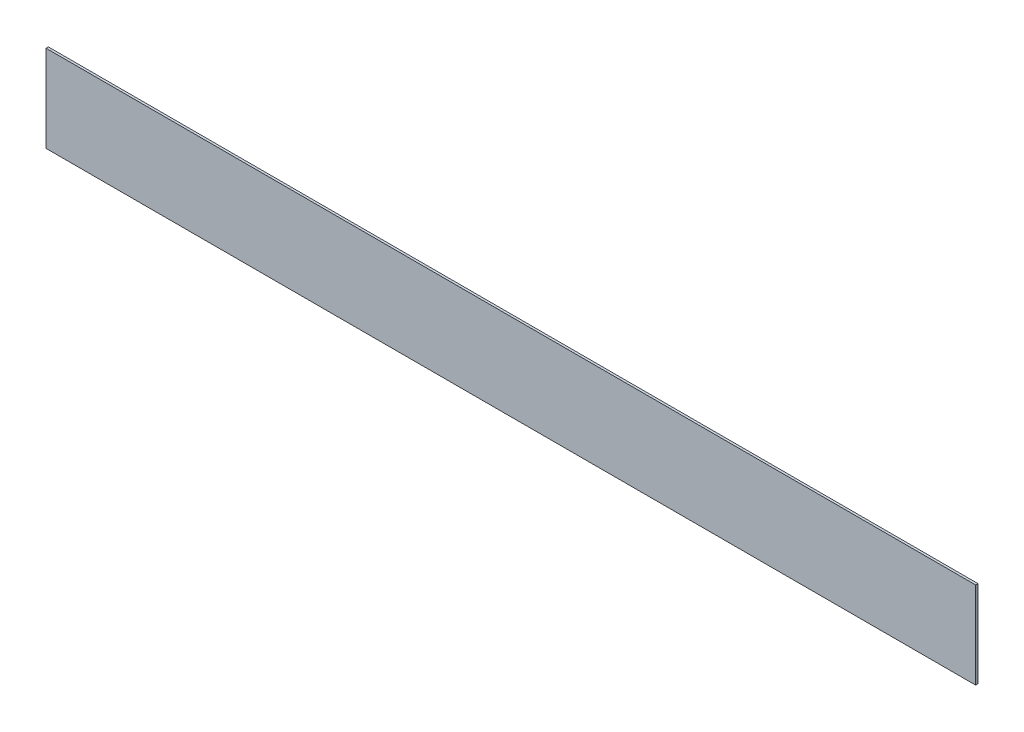
ISO-10303-21;
HEADER;
FILE_DESCRIPTION(('STEP AP214'),'2;1');
FILE_NAME('part.step','',(''),(''),'','','');
FILE_SCHEMA(('AUTOMOTIVE_DESIGN { 1 0 10303 214 1 1 1 1 }'));
ENDSEC;
DATA;
#1=APPLICATION_CONTEXT('core data for automotive mechanical design processes');
#2=APPLICATION_PROTOCOL_DEFINITION('international standard','automotive_design',2000,#1);
#3=PRODUCT_CONTEXT('',#1,'mechanical');
#4=PRODUCT('Part','Part','',(#3));
#5=PRODUCT_RELATED_PRODUCT_CATEGORY('part','',(#4));
#6=PRODUCT_DEFINITION_FORMATION('','',#4);
#7=PRODUCT_DEFINITION_CONTEXT('part definition',#1,'design');
#8=PRODUCT_DEFINITION('design','',#6,#7);
#9=PRODUCT_DEFINITION_SHAPE('','',#8);
#10=(LENGTH_UNIT() NAMED_UNIT(*) SI_UNIT(.MILLI.,.METRE.));
#11=(NAMED_UNIT(*) PLANE_ANGLE_UNIT() SI_UNIT($,.RADIAN.));
#12=(NAMED_UNIT(*) SI_UNIT($,.STERADIAN.) SOLID_ANGLE_UNIT());
#13=UNCERTAINTY_MEASURE_WITH_UNIT(LENGTH_MEASURE(1.E-05),#10,'distance_accuracy_value','');
#14=(GEOMETRIC_REPRESENTATION_CONTEXT(3) GLOBAL_UNCERTAINTY_ASSIGNED_CONTEXT((#13)) GLOBAL_UNIT_ASSIGNED_CONTEXT((#10,
#11,#12)) REPRESENTATION_CONTEXT('',''));
#15=CARTESIAN_POINT('',(0.,0.,0.));
#16=DIRECTION('',(0.,0.,1.));
#17=DIRECTION('',(1.,0.,0.));
#18=AXIS2_PLACEMENT_3D('',#15,#16,#17);
#19=CARTESIAN_POINT('',(457.2,42.672,1.143));
#20=DIRECTION('',(-1.,0.,0.));
#21=DIRECTION('',(0.,0.,1.));
#22=AXIS2_PLACEMENT_3D('',#19,#20,#21);
#23=PLANE('',#22);
#24=DIRECTION('',(0.,1.,0.));
#25=VECTOR('',#24,1.);
#26=CARTESIAN_POINT('',(457.2,42.672,-1.143));
#27=LINE('',#26,#25);
#28=CARTESIAN_POINT('',(457.2,-42.672,-1.143));
#29=VERTEX_POINT('',#28);
#30=CARTESIAN_POINT('',(457.2,42.672,-1.143));
#31=VERTEX_POINT('',#30);
#32=EDGE_CURVE('E96',#29,#31,#27,.T.);
#33=ORIENTED_EDGE('',*,*,#32,.T.);
#34=DIRECTION('',(0.,0.,-1.));
#35=VECTOR('',#34,1.);
#36=CARTESIAN_POINT('',(457.2,42.672,1.143));
#37=LINE('',#36,#35);
#38=CARTESIAN_POINT('',(457.2,42.672,1.143));
#39=VERTEX_POINT('',#38);
#40=EDGE_CURVE('E11',#39,#31,#37,.T.);
#41=ORIENTED_EDGE('',*,*,#40,.F.);
#42=DIRECTION('',(0.,1.,0.));
#43=VECTOR('',#42,1.);
#44=CARTESIAN_POINT('',(457.2,42.672,1.143));
#45=LINE('',#44,#43);
#46=CARTESIAN_POINT('',(457.2,-42.672,1.143));
#47=VERTEX_POINT('',#46);
#48=EDGE_CURVE('E84',#47,#39,#45,.T.);
#49=ORIENTED_EDGE('',*,*,#48,.F.);
#50=DIRECTION('',(0.,0.,-1.));
#51=VECTOR('',#50,1.);
#52=CARTESIAN_POINT('',(457.2,-42.672,1.143));
#53=LINE('',#52,#51);
#54=EDGE_CURVE('E92',#47,#29,#53,.T.);
#55=ORIENTED_EDGE('',*,*,#54,.T.);
#56=EDGE_LOOP('',(#33,#41,#49,#55));
#57=FACE_BOUND('',#56,.T.);
#58=ADVANCED_FACE('F33',(#57),#23,.F.);
#59=CARTESIAN_POINT('',(-457.2,42.672,1.143));
#60=DIRECTION('',(0.,-1.,0.));
#61=DIRECTION('',(0.,0.,-1.));
#62=AXIS2_PLACEMENT_3D('',#59,#60,#61);
#63=PLANE('',#62);
#64=DIRECTION('',(-1.,0.,0.));
#65=VECTOR('',#64,1.);
#66=CARTESIAN_POINT('',(-457.2,42.672,-1.143));
#67=LINE('',#66,#65);
#68=CARTESIAN_POINT('',(-457.2,42.672,-1.143));
#69=VERTEX_POINT('',#68);
#70=EDGE_CURVE('E88',#31,#69,#67,.T.);
#71=ORIENTED_EDGE('',*,*,#70,.T.);
#72=DIRECTION('',(0.,0.,-1.));
#73=VECTOR('',#72,1.);
#74=CARTESIAN_POINT('',(-457.2,42.672,1.143));
#75=LINE('',#74,#73);
#76=CARTESIAN_POINT('',(-457.2,42.672,1.143));
#77=VERTEX_POINT('',#76);
#78=EDGE_CURVE('E41',#77,#69,#75,.T.);
#79=ORIENTED_EDGE('',*,*,#78,.F.);
#80=DIRECTION('',(-1.,0.,0.));
#81=VECTOR('',#80,1.);
#82=CARTESIAN_POINT('',(-457.2,42.672,1.143));
#83=LINE('',#82,#81);
#84=EDGE_CURVE('E79',#39,#77,#83,.T.);
#85=ORIENTED_EDGE('',*,*,#84,.F.);
#86=ORIENTED_EDGE('',*,*,#40,.T.);
#87=EDGE_LOOP('',(#71,#79,#85,#86));
#88=FACE_BOUND('',#87,.T.);
#89=ADVANCED_FACE('F87',(#88),#63,.F.);
#90=CARTESIAN_POINT('',(-457.2,42.672,1.143));
#91=DIRECTION('',(1.,0.,0.));
#92=DIRECTION('',(0.,1.,0.));
#93=AXIS2_PLACEMENT_3D('',#90,#91,#92);
#94=PLANE('',#93);
#95=DIRECTION('',(0.,-1.,0.));
#96=VECTOR('',#95,1.);
#97=CARTESIAN_POINT('',(-457.2,42.672,-1.143));
#98=LINE('',#97,#96);
#99=CARTESIAN_POINT('',(-457.2,-42.672,-1.143));
#100=VERTEX_POINT('',#99);
#101=EDGE_CURVE('E66',#69,#100,#98,.T.);
#102=ORIENTED_EDGE('',*,*,#101,.T.);
#103=DIRECTION('',(0.,0.,-1.));
#104=VECTOR('',#103,1.);
#105=CARTESIAN_POINT('',(-457.2,-42.672,1.143));
#106=LINE('',#105,#104);
#107=CARTESIAN_POINT('',(-457.2,-42.672,1.143));
#108=VERTEX_POINT('',#107);
#109=EDGE_CURVE('E89',#108,#100,#106,.T.);
#110=ORIENTED_EDGE('',*,*,#109,.F.);
#111=DIRECTION('',(0.,-1.,0.));
#112=VECTOR('',#111,1.);
#113=CARTESIAN_POINT('',(-457.2,42.672,1.143));
#114=LINE('',#113,#112);
#115=EDGE_CURVE('E82',#77,#108,#114,.T.);
#116=ORIENTED_EDGE('',*,*,#115,.F.);
#117=ORIENTED_EDGE('',*,*,#78,.T.);
#118=EDGE_LOOP('',(#102,#110,#116,#117));
#119=FACE_BOUND('',#118,.T.);
#120=ADVANCED_FACE('F90',(#119),#94,.F.);
#121=CARTESIAN_POINT('',(-457.2,-42.672,1.143));
#122=DIRECTION('',(0.,1.,0.));
#123=DIRECTION('',(0.,0.,1.));
#124=AXIS2_PLACEMENT_3D('',#121,#122,#123);
#125=PLANE('',#124);
#126=DIRECTION('',(1.,0.,0.));
#127=VECTOR('',#126,1.);
#128=CARTESIAN_POINT('',(-457.2,-42.672,-1.143));
#129=LINE('',#128,#127);
#130=EDGE_CURVE('E72',#100,#29,#129,.T.);
#131=ORIENTED_EDGE('',*,*,#130,.T.);
#132=ORIENTED_EDGE('',*,*,#54,.F.);
#133=DIRECTION('',(1.,0.,0.));
#134=VECTOR('',#133,1.);
#135=CARTESIAN_POINT('',(-457.2,-42.672,1.143));
#136=LINE('',#135,#134);
#137=EDGE_CURVE('E49',#108,#47,#136,.T.);
#138=ORIENTED_EDGE('',*,*,#137,.F.);
#139=ORIENTED_EDGE('',*,*,#109,.T.);
#140=EDGE_LOOP('',(#131,#132,#138,#139));
#141=FACE_BOUND('',#140,.T.);
#142=ADVANCED_FACE('F103',(#141),#125,.F.);
#143=CARTESIAN_POINT('',(0.,0.,1.143));
#144=DIRECTION('',(0.,0.,1.));
#145=DIRECTION('',(1.,0.,0.));
#146=AXIS2_PLACEMENT_3D('',#143,#144,#145);
#147=PLANE('',#146);
#148=ORIENTED_EDGE('',*,*,#48,.T.);
#149=ORIENTED_EDGE('',*,*,#84,.T.);
#150=ORIENTED_EDGE('',*,*,#115,.T.);
#151=ORIENTED_EDGE('',*,*,#137,.T.);
#152=EDGE_LOOP('',(#148,#149,#150,#151));
#153=FACE_BOUND('',#152,.T.);
#154=ADVANCED_FACE('F80',(#153),#147,.T.);
#155=CARTESIAN_POINT('',(0.,0.,-1.143));
#156=DIRECTION('',(0.,0.,1.));
#157=DIRECTION('',(1.,0.,0.));
#158=AXIS2_PLACEMENT_3D('',#155,#156,#157);
#159=PLANE('',#158);
#160=ORIENTED_EDGE('',*,*,#32,.F.);
#161=ORIENTED_EDGE('',*,*,#130,.F.);
#162=ORIENTED_EDGE('',*,*,#101,.F.);
#163=ORIENTED_EDGE('',*,*,#70,.F.);
#164=EDGE_LOOP('',(#160,#161,#162,#163));
#165=FACE_BOUND('',#164,.T.);
#166=ADVANCED_FACE('F106',(#165),#159,.F.);
#167=CLOSED_SHELL('',(#58,#89,#120,#142,#154,#166));
#168=MANIFOLD_SOLID_BREP('B2',#167);
#169=ADVANCED_BREP_SHAPE_REPRESENTATION('',(#18,#168),#14);
#170=SHAPE_DEFINITION_REPRESENTATION(#9,#169);
ENDSEC;
END-ISO-10303-21;
